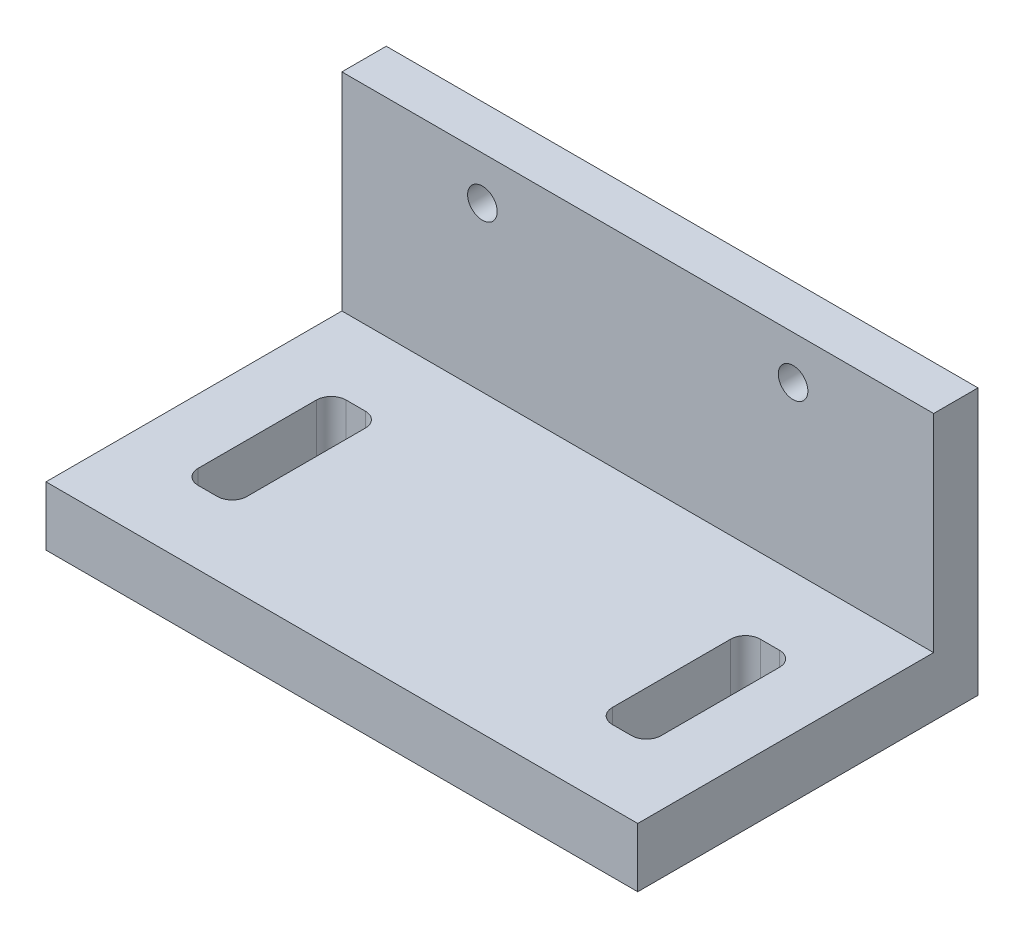
ISO-10303-21;
HEADER;
FILE_DESCRIPTION(('STEP AP214'),'2;1');
FILE_NAME('part.step','',(''),(''),'','','');
FILE_SCHEMA(('AUTOMOTIVE_DESIGN { 1 0 10303 214 1 1 1 1 }'));
ENDSEC;
DATA;
#1=APPLICATION_CONTEXT('core data for automotive mechanical design processes');
#2=APPLICATION_PROTOCOL_DEFINITION('international standard','automotive_design',2000,#1);
#3=PRODUCT_CONTEXT('',#1,'mechanical');
#4=PRODUCT('Part','Part','',(#3));
#5=PRODUCT_RELATED_PRODUCT_CATEGORY('part','',(#4));
#6=PRODUCT_DEFINITION_FORMATION('','',#4);
#7=PRODUCT_DEFINITION_CONTEXT('part definition',#1,'design');
#8=PRODUCT_DEFINITION('design','',#6,#7);
#9=PRODUCT_DEFINITION_SHAPE('','',#8);
#10=(LENGTH_UNIT() NAMED_UNIT(*) SI_UNIT(.MILLI.,.METRE.));
#11=(NAMED_UNIT(*) PLANE_ANGLE_UNIT() SI_UNIT($,.RADIAN.));
#12=(NAMED_UNIT(*) SI_UNIT($,.STERADIAN.) SOLID_ANGLE_UNIT());
#13=UNCERTAINTY_MEASURE_WITH_UNIT(LENGTH_MEASURE(1.E-05),#10,'distance_accuracy_value','');
#14=(GEOMETRIC_REPRESENTATION_CONTEXT(3) GLOBAL_UNCERTAINTY_ASSIGNED_CONTEXT((#13)) GLOBAL_UNIT_ASSIGNED_CONTEXT((#10,
#11,#12)) REPRESENTATION_CONTEXT('',''));
#15=CARTESIAN_POINT('',(0.,0.,0.));
#16=DIRECTION('',(0.,0.,1.));
#17=DIRECTION('',(1.,0.,0.));
#18=AXIS2_PLACEMENT_3D('',#15,#16,#17);
#19=CARTESIAN_POINT('',(0.,4.,0.));
#20=DIRECTION('',(0.,1.,0.));
#21=DIRECTION('',(0.,0.,1.));
#22=AXIS2_PLACEMENT_3D('',#19,#20,#21);
#23=PLANE('',#22);
#24=DIRECTION('',(0.,0.,-1.));
#25=VECTOR('',#24,1.);
#26=CARTESIAN_POINT('',(20.,4.,-10.));
#27=LINE('',#26,#25);
#28=CARTESIAN_POINT('',(20.,4.,10.));
#29=VERTEX_POINT('',#28);
#30=CARTESIAN_POINT('',(20.,4.,-10.));
#31=VERTEX_POINT('',#30);
#32=EDGE_CURVE('E331',#29,#31,#27,.T.);
#33=ORIENTED_EDGE('',*,*,#32,.T.);
#34=DIRECTION('',(-1.,0.,0.));
#35=VECTOR('',#34,1.);
#36=CARTESIAN_POINT('',(-20.,4.,-10.));
#37=LINE('',#36,#35);
#38=CARTESIAN_POINT('',(-20.,4.,-10.));
#39=VERTEX_POINT('',#38);
#40=EDGE_CURVE('E337',#31,#39,#37,.T.);
#41=ORIENTED_EDGE('',*,*,#40,.T.);
#42=DIRECTION('',(0.,0.,1.));
#43=VECTOR('',#42,1.);
#44=CARTESIAN_POINT('',(-20.,4.,-10.));
#45=LINE('',#44,#43);
#46=CARTESIAN_POINT('',(-20.,4.,10.));
#47=VERTEX_POINT('',#46);
#48=EDGE_CURVE('E211',#39,#47,#45,.T.);
#49=ORIENTED_EDGE('',*,*,#48,.T.);
#50=DIRECTION('',(1.,0.,0.));
#51=VECTOR('',#50,1.);
#52=CARTESIAN_POINT('',(-20.,4.,10.));
#53=LINE('',#52,#51);
#54=EDGE_CURVE('E338',#47,#29,#53,.T.);
#55=ORIENTED_EDGE('',*,*,#54,.T.);
#56=EDGE_LOOP('',(#33,#41,#49,#55));
#57=FACE_BOUND('',#56,.T.);
#58=DIRECTION('',(1.,0.,0.));
#59=VECTOR('',#58,1.);
#60=CARTESIAN_POINT('',(13.35,4.,5.06811078955843));
#61=LINE('',#60,#59);
#62=CARTESIAN_POINT('',(13.35,4.,5.06811078955843));
#63=VERTEX_POINT('',#62);
#64=CARTESIAN_POINT('',(14.65,4.,5.06811078955843));
#65=VERTEX_POINT('',#64);
#66=EDGE_CURVE('E277',#63,#65,#61,.T.);
#67=ORIENTED_EDGE('',*,*,#66,.F.);
#68=CARTESIAN_POINT('',(13.35,4.,4.06811078955843));
#69=DIRECTION('',(0.,1.,0.));
#70=DIRECTION('',(0.,0.,-1.));
#71=AXIS2_PLACEMENT_3D('',#68,#69,#70);
#72=CIRCLE('',#71,1.);
#73=CARTESIAN_POINT('',(12.35,4.,4.06811078955842));
#74=VERTEX_POINT('',#73);
#75=EDGE_CURVE('E274',#74,#63,#72,.T.);
#76=ORIENTED_EDGE('',*,*,#75,.F.);
#77=DIRECTION('',(0.,0.,1.));
#78=VECTOR('',#77,1.);
#79=CARTESIAN_POINT('',(12.35,4.,-3.93188921044157));
#80=LINE('',#79,#78);
#81=CARTESIAN_POINT('',(12.35,4.,-3.93188921044157));
#82=VERTEX_POINT('',#81);
#83=EDGE_CURVE('E289',#82,#74,#80,.T.);
#84=ORIENTED_EDGE('',*,*,#83,.F.);
#85=CARTESIAN_POINT('',(13.35,4.,-3.93188921044157));
#86=DIRECTION('',(0.,1.,0.));
#87=DIRECTION('',(0.,0.,-1.));
#88=AXIS2_PLACEMENT_3D('',#85,#86,#87);
#89=CIRCLE('',#88,1.);
#90=CARTESIAN_POINT('',(13.35,4.,-4.93188921044158));
#91=VERTEX_POINT('',#90);
#92=EDGE_CURVE('E290',#91,#82,#89,.T.);
#93=ORIENTED_EDGE('',*,*,#92,.F.);
#94=DIRECTION('',(-1.,0.,0.));
#95=VECTOR('',#94,1.);
#96=CARTESIAN_POINT('',(13.35,4.,-4.93188921044158));
#97=LINE('',#96,#95);
#98=CARTESIAN_POINT('',(14.65,4.,-4.93188921044157));
#99=VERTEX_POINT('',#98);
#100=EDGE_CURVE('E284',#99,#91,#97,.T.);
#101=ORIENTED_EDGE('',*,*,#100,.F.);
#102=CARTESIAN_POINT('',(14.65,4.,-3.93188921044157));
#103=DIRECTION('',(0.,1.,0.));
#104=DIRECTION('',(0.,0.,1.));
#105=AXIS2_PLACEMENT_3D('',#102,#103,#104);
#106=CIRCLE('',#105,1.);
#107=CARTESIAN_POINT('',(15.65,4.,-3.93188921044157));
#108=VERTEX_POINT('',#107);
#109=EDGE_CURVE('E282',#108,#99,#106,.T.);
#110=ORIENTED_EDGE('',*,*,#109,.F.);
#111=DIRECTION('',(0.,0.,-1.));
#112=VECTOR('',#111,1.);
#113=CARTESIAN_POINT('',(15.65,4.,-3.93188921044157));
#114=LINE('',#113,#112);
#115=CARTESIAN_POINT('',(15.65,4.,4.06811078955842));
#116=VERTEX_POINT('',#115);
#117=EDGE_CURVE('E281',#116,#108,#114,.T.);
#118=ORIENTED_EDGE('',*,*,#117,.F.);
#119=CARTESIAN_POINT('',(14.65,4.,4.06811078955843));
#120=DIRECTION('',(0.,1.,0.));
#121=DIRECTION('',(0.,0.,1.));
#122=AXIS2_PLACEMENT_3D('',#119,#120,#121);
#123=CIRCLE('',#122,1.);
#124=EDGE_CURVE('E276',#65,#116,#123,.T.);
#125=ORIENTED_EDGE('',*,*,#124,.F.);
#126=EDGE_LOOP('',(#67,#76,#84,#93,#101,#110,#118,#125));
#127=FACE_BOUND('',#126,.T.);
#128=DIRECTION('',(-1.,0.,0.));
#129=VECTOR('',#128,1.);
#130=CARTESIAN_POINT('',(-13.35,4.,-4.93188921044158));
#131=LINE('',#130,#129);
#132=CARTESIAN_POINT('',(-13.35,4.,-4.93188921044158));
#133=VERTEX_POINT('',#132);
#134=CARTESIAN_POINT('',(-14.65,4.,-4.93188921044157));
#135=VERTEX_POINT('',#134);
#136=EDGE_CURVE('E222',#133,#135,#131,.T.);
#137=ORIENTED_EDGE('',*,*,#136,.F.);
#138=CARTESIAN_POINT('',(-13.35,4.,-3.93188921044157));
#139=DIRECTION('',(0.,1.,0.));
#140=DIRECTION('',(0.,0.,1.));
#141=AXIS2_PLACEMENT_3D('',#138,#139,#140);
#142=CIRCLE('',#141,1.);
#143=CARTESIAN_POINT('',(-12.35,4.,-3.93188921044157));
#144=VERTEX_POINT('',#143);
#145=EDGE_CURVE('E225',#144,#133,#142,.T.);
#146=ORIENTED_EDGE('',*,*,#145,.F.);
#147=DIRECTION('',(0.,0.,-1.));
#148=VECTOR('',#147,1.);
#149=CARTESIAN_POINT('',(-12.35,4.,-3.93188921044157));
#150=LINE('',#149,#148);
#151=CARTESIAN_POINT('',(-12.35,4.,4.06811078955842));
#152=VERTEX_POINT('',#151);
#153=EDGE_CURVE('E240',#152,#144,#150,.T.);
#154=ORIENTED_EDGE('',*,*,#153,.F.);
#155=CARTESIAN_POINT('',(-13.35,4.,4.06811078955843));
#156=DIRECTION('',(0.,1.,0.));
#157=DIRECTION('',(0.,0.,1.));
#158=AXIS2_PLACEMENT_3D('',#155,#156,#157);
#159=CIRCLE('',#158,1.);
#160=CARTESIAN_POINT('',(-13.35,4.,5.06811078955842));
#161=VERTEX_POINT('',#160);
#162=EDGE_CURVE('E232',#161,#152,#159,.T.);
#163=ORIENTED_EDGE('',*,*,#162,.F.);
#164=DIRECTION('',(1.,0.,0.));
#165=VECTOR('',#164,1.);
#166=CARTESIAN_POINT('',(-13.35,4.,5.06811078955843));
#167=LINE('',#166,#165);
#168=CARTESIAN_POINT('',(-14.65,4.,5.06811078955843));
#169=VERTEX_POINT('',#168);
#170=EDGE_CURVE('E231',#169,#161,#167,.T.);
#171=ORIENTED_EDGE('',*,*,#170,.F.);
#172=CARTESIAN_POINT('',(-14.65,4.,4.06811078955843));
#173=DIRECTION('',(0.,1.,0.));
#174=DIRECTION('',(0.,0.,-1.));
#175=AXIS2_PLACEMENT_3D('',#172,#173,#174);
#176=CIRCLE('',#175,1.);
#177=CARTESIAN_POINT('',(-15.65,4.,4.06811078955842));
#178=VERTEX_POINT('',#177);
#179=EDGE_CURVE('E233',#178,#169,#176,.T.);
#180=ORIENTED_EDGE('',*,*,#179,.F.);
#181=DIRECTION('',(0.,0.,1.));
#182=VECTOR('',#181,1.);
#183=CARTESIAN_POINT('',(-15.65,4.,-3.93188921044157));
#184=LINE('',#183,#182);
#185=CARTESIAN_POINT('',(-15.65,4.,-3.93188921044157));
#186=VERTEX_POINT('',#185);
#187=EDGE_CURVE('E230',#186,#178,#184,.T.);
#188=ORIENTED_EDGE('',*,*,#187,.F.);
#189=CARTESIAN_POINT('',(-14.65,4.,-3.93188921044157));
#190=DIRECTION('',(0.,1.,0.));
#191=DIRECTION('',(0.,0.,-1.));
#192=AXIS2_PLACEMENT_3D('',#189,#190,#191);
#193=CIRCLE('',#192,1.);
#194=EDGE_CURVE('E227',#135,#186,#193,.T.);
#195=ORIENTED_EDGE('',*,*,#194,.F.);
#196=EDGE_LOOP('',(#137,#146,#154,#163,#171,#180,#188,#195));
#197=FACE_BOUND('',#196,.T.);
#198=ADVANCED_FACE('F39',(#57,#127,#197),#23,.T.);
#199=CARTESIAN_POINT('',(0.,0.,0.));
#200=DIRECTION('',(0.,1.,0.));
#201=DIRECTION('',(0.,0.,1.));
#202=AXIS2_PLACEMENT_3D('',#199,#200,#201);
#203=PLANE('',#202);
#204=CARTESIAN_POINT('',(13.35,0.,4.06811078955843));
#205=DIRECTION('',(0.,1.,0.));
#206=DIRECTION('',(0.,0.,-1.));
#207=AXIS2_PLACEMENT_3D('',#204,#205,#206);
#208=CIRCLE('',#207,1.);
#209=CARTESIAN_POINT('',(12.35,0.,4.06811078955842));
#210=VERTEX_POINT('',#209);
#211=CARTESIAN_POINT('',(13.35,0.,5.06811078955843));
#212=VERTEX_POINT('',#211);
#213=EDGE_CURVE('E271',#210,#212,#208,.T.);
#214=ORIENTED_EDGE('',*,*,#213,.T.);
#215=DIRECTION('',(1.,0.,0.));
#216=VECTOR('',#215,1.);
#217=CARTESIAN_POINT('',(13.35,0.,5.06811078955843));
#218=LINE('',#217,#216);
#219=CARTESIAN_POINT('',(14.65,0.,5.06811078955843));
#220=VERTEX_POINT('',#219);
#221=EDGE_CURVE('E294',#212,#220,#218,.T.);
#222=ORIENTED_EDGE('',*,*,#221,.T.);
#223=CARTESIAN_POINT('',(14.65,0.,4.06811078955843));
#224=DIRECTION('',(0.,1.,0.));
#225=DIRECTION('',(0.,0.,1.));
#226=AXIS2_PLACEMENT_3D('',#223,#224,#225);
#227=CIRCLE('',#226,1.);
#228=CARTESIAN_POINT('',(15.65,0.,4.06811078955842));
#229=VERTEX_POINT('',#228);
#230=EDGE_CURVE('E296',#220,#229,#227,.T.);
#231=ORIENTED_EDGE('',*,*,#230,.T.);
#232=DIRECTION('',(0.,0.,-1.));
#233=VECTOR('',#232,1.);
#234=CARTESIAN_POINT('',(15.65,0.,-3.93188921044157));
#235=LINE('',#234,#233);
#236=CARTESIAN_POINT('',(15.65,0.,-3.93188921044157));
#237=VERTEX_POINT('',#236);
#238=EDGE_CURVE('E301',#229,#237,#235,.T.);
#239=ORIENTED_EDGE('',*,*,#238,.T.);
#240=CARTESIAN_POINT('',(14.65,0.,-3.93188921044157));
#241=DIRECTION('',(0.,1.,0.));
#242=DIRECTION('',(0.,0.,1.));
#243=AXIS2_PLACEMENT_3D('',#240,#241,#242);
#244=CIRCLE('',#243,1.);
#245=CARTESIAN_POINT('',(14.65,0.,-4.93188921044157));
#246=VERTEX_POINT('',#245);
#247=EDGE_CURVE('E302',#237,#246,#244,.T.);
#248=ORIENTED_EDGE('',*,*,#247,.T.);
#249=DIRECTION('',(-1.,0.,0.));
#250=VECTOR('',#249,1.);
#251=CARTESIAN_POINT('',(13.35,0.,-4.93188921044158));
#252=LINE('',#251,#250);
#253=CARTESIAN_POINT('',(13.35,0.,-4.93188921044158));
#254=VERTEX_POINT('',#253);
#255=EDGE_CURVE('E310',#246,#254,#252,.T.);
#256=ORIENTED_EDGE('',*,*,#255,.T.);
#257=CARTESIAN_POINT('',(13.35,0.,-3.93188921044157));
#258=DIRECTION('',(0.,1.,0.));
#259=DIRECTION('',(0.,0.,-1.));
#260=AXIS2_PLACEMENT_3D('',#257,#258,#259);
#261=CIRCLE('',#260,1.);
#262=CARTESIAN_POINT('',(12.35,0.,-3.93188921044157));
#263=VERTEX_POINT('',#262);
#264=EDGE_CURVE('E309',#254,#263,#261,.T.);
#265=ORIENTED_EDGE('',*,*,#264,.T.);
#266=DIRECTION('',(0.,0.,1.));
#267=VECTOR('',#266,1.);
#268=CARTESIAN_POINT('',(12.35,0.,-3.93188921044157));
#269=LINE('',#268,#267);
#270=EDGE_CURVE('E280',#263,#210,#269,.T.);
#271=ORIENTED_EDGE('',*,*,#270,.T.);
#272=EDGE_LOOP('',(#214,#222,#231,#239,#248,#256,#265,#271));
#273=FACE_BOUND('',#272,.T.);
#274=DIRECTION('',(0.,0.,-1.));
#275=VECTOR('',#274,1.);
#276=CARTESIAN_POINT('',(20.,0.,-10.));
#277=LINE('',#276,#275);
#278=CARTESIAN_POINT('',(20.,0.,10.));
#279=VERTEX_POINT('',#278);
#280=CARTESIAN_POINT('',(20.,0.,-13.));
#281=VERTEX_POINT('',#280);
#282=EDGE_CURVE('E335',#279,#281,#277,.T.);
#283=ORIENTED_EDGE('',*,*,#282,.F.);
#284=DIRECTION('',(1.,0.,0.));
#285=VECTOR('',#284,1.);
#286=CARTESIAN_POINT('',(-20.,0.,10.));
#287=LINE('',#286,#285);
#288=CARTESIAN_POINT('',(-20.,0.,10.));
#289=VERTEX_POINT('',#288);
#290=EDGE_CURVE('E340',#289,#279,#287,.T.);
#291=ORIENTED_EDGE('',*,*,#290,.F.);
#292=DIRECTION('',(0.,0.,1.));
#293=VECTOR('',#292,1.);
#294=CARTESIAN_POINT('',(-20.,0.,-10.));
#295=LINE('',#294,#293);
#296=CARTESIAN_POINT('',(-20.,0.,-13.));
#297=VERTEX_POINT('',#296);
#298=EDGE_CURVE('E344',#297,#289,#295,.T.);
#299=ORIENTED_EDGE('',*,*,#298,.F.);
#300=DIRECTION('',(-1.,0.,0.));
#301=VECTOR('',#300,1.);
#302=CARTESIAN_POINT('',(-20.,0.,-13.));
#303=LINE('',#302,#301);
#304=EDGE_CURVE('E209',#281,#297,#303,.T.);
#305=ORIENTED_EDGE('',*,*,#304,.F.);
#306=EDGE_LOOP('',(#283,#291,#299,#305));
#307=FACE_BOUND('',#306,.T.);
#308=CARTESIAN_POINT('',(-13.35,0.,-3.93188921044157));
#309=DIRECTION('',(0.,1.,0.));
#310=DIRECTION('',(0.,0.,1.));
#311=AXIS2_PLACEMENT_3D('',#308,#309,#310);
#312=CIRCLE('',#311,1.);
#313=CARTESIAN_POINT('',(-12.35,0.,-3.93188921044157));
#314=VERTEX_POINT('',#313);
#315=CARTESIAN_POINT('',(-13.35,0.,-4.93188921044158));
#316=VERTEX_POINT('',#315);
#317=EDGE_CURVE('E65',#314,#316,#312,.T.);
#318=ORIENTED_EDGE('',*,*,#317,.T.);
#319=DIRECTION('',(-1.,0.,0.));
#320=VECTOR('',#319,1.);
#321=CARTESIAN_POINT('',(-13.35,0.,-4.93188921044158));
#322=LINE('',#321,#320);
#323=CARTESIAN_POINT('',(-14.65,0.,-4.93188921044157));
#324=VERTEX_POINT('',#323);
#325=EDGE_CURVE('E216',#316,#324,#322,.T.);
#326=ORIENTED_EDGE('',*,*,#325,.T.);
#327=CARTESIAN_POINT('',(-14.65,0.,-3.93188921044157));
#328=DIRECTION('',(0.,1.,0.));
#329=DIRECTION('',(0.,0.,-1.));
#330=AXIS2_PLACEMENT_3D('',#327,#328,#329);
#331=CIRCLE('',#330,1.);
#332=CARTESIAN_POINT('',(-15.65,0.,-3.93188921044157));
#333=VERTEX_POINT('',#332);
#334=EDGE_CURVE('E245',#324,#333,#331,.T.);
#335=ORIENTED_EDGE('',*,*,#334,.T.);
#336=DIRECTION('',(0.,0.,1.));
#337=VECTOR('',#336,1.);
#338=CARTESIAN_POINT('',(-15.65,0.,-3.93188921044157));
#339=LINE('',#338,#337);
#340=CARTESIAN_POINT('',(-15.65,0.,4.06811078955842));
#341=VERTEX_POINT('',#340);
#342=EDGE_CURVE('E244',#333,#341,#339,.T.);
#343=ORIENTED_EDGE('',*,*,#342,.T.);
#344=CARTESIAN_POINT('',(-14.65,0.,4.06811078955843));
#345=DIRECTION('',(0.,1.,0.));
#346=DIRECTION('',(0.,0.,-1.));
#347=AXIS2_PLACEMENT_3D('',#344,#345,#346);
#348=CIRCLE('',#347,1.);
#349=CARTESIAN_POINT('',(-14.65,0.,5.06811078955843));
#350=VERTEX_POINT('',#349);
#351=EDGE_CURVE('E247',#341,#350,#348,.T.);
#352=ORIENTED_EDGE('',*,*,#351,.T.);
#353=DIRECTION('',(1.,0.,0.));
#354=VECTOR('',#353,1.);
#355=CARTESIAN_POINT('',(-13.35,0.,5.06811078955843));
#356=LINE('',#355,#354);
#357=CARTESIAN_POINT('',(-13.35,0.,5.06811078955842));
#358=VERTEX_POINT('',#357);
#359=EDGE_CURVE('E252',#350,#358,#356,.T.);
#360=ORIENTED_EDGE('',*,*,#359,.T.);
#361=CARTESIAN_POINT('',(-13.35,0.,4.06811078955843));
#362=DIRECTION('',(0.,1.,0.));
#363=DIRECTION('',(0.,0.,1.));
#364=AXIS2_PLACEMENT_3D('',#361,#362,#363);
#365=CIRCLE('',#364,1.);
#366=CARTESIAN_POINT('',(-12.35,0.,4.06811078955842));
#367=VERTEX_POINT('',#366);
#368=EDGE_CURVE('E251',#358,#367,#365,.T.);
#369=ORIENTED_EDGE('',*,*,#368,.T.);
#370=DIRECTION('',(0.,0.,-1.));
#371=VECTOR('',#370,1.);
#372=CARTESIAN_POINT('',(-12.35,0.,-3.93188921044157));
#373=LINE('',#372,#371);
#374=EDGE_CURVE('E224',#367,#314,#373,.T.);
#375=ORIENTED_EDGE('',*,*,#374,.T.);
#376=EDGE_LOOP('',(#318,#326,#335,#343,#352,#360,#369,#375));
#377=FACE_BOUND('',#376,.T.);
#378=ADVANCED_FACE('F357',(#273,#307,#377),#203,.F.);
#379=CARTESIAN_POINT('',(20.,4.,-10.));
#380=DIRECTION('',(-1.,0.,0.));
#381=DIRECTION('',(0.,0.,1.));
#382=AXIS2_PLACEMENT_3D('',#379,#380,#381);
#383=PLANE('',#382);
#384=ORIENTED_EDGE('',*,*,#282,.T.);
#385=DIRECTION('',(0.,-1.,0.));
#386=VECTOR('',#385,1.);
#387=CARTESIAN_POINT('',(20.,18.,-13.));
#388=LINE('',#387,#386);
#389=CARTESIAN_POINT('',(20.,18.,-13.));
#390=VERTEX_POINT('',#389);
#391=EDGE_CURVE('E217',#390,#281,#388,.T.);
#392=ORIENTED_EDGE('',*,*,#391,.F.);
#393=DIRECTION('',(0.,0.,-1.));
#394=VECTOR('',#393,1.);
#395=CARTESIAN_POINT('',(20.,18.,-10.));
#396=LINE('',#395,#394);
#397=CARTESIAN_POINT('',(20.,18.,-10.));
#398=VERTEX_POINT('',#397);
#399=EDGE_CURVE('E198',#398,#390,#396,.T.);
#400=ORIENTED_EDGE('',*,*,#399,.F.);
#401=DIRECTION('',(0.,-1.,0.));
#402=VECTOR('',#401,1.);
#403=CARTESIAN_POINT('',(20.,18.,-10.));
#404=LINE('',#403,#402);
#405=EDGE_CURVE('E196',#398,#31,#404,.T.);
#406=ORIENTED_EDGE('',*,*,#405,.T.);
#407=ORIENTED_EDGE('',*,*,#32,.F.);
#408=DIRECTION('',(0.,-1.,0.));
#409=VECTOR('',#408,1.);
#410=CARTESIAN_POINT('',(20.,4.,10.));
#411=LINE('',#410,#409);
#412=EDGE_CURVE('E50',#29,#279,#411,.T.);
#413=ORIENTED_EDGE('',*,*,#412,.T.);
#414=EDGE_LOOP('',(#384,#392,#400,#406,#407,#413));
#415=FACE_BOUND('',#414,.T.);
#416=ADVANCED_FACE('F41',(#415),#383,.F.);
#417=CARTESIAN_POINT('',(-20.,4.,-10.));
#418=DIRECTION('',(1.,0.,0.));
#419=DIRECTION('',(0.,0.,-1.));
#420=AXIS2_PLACEMENT_3D('',#417,#418,#419);
#421=PLANE('',#420);
#422=ORIENTED_EDGE('',*,*,#298,.T.);
#423=DIRECTION('',(0.,-1.,0.));
#424=VECTOR('',#423,1.);
#425=CARTESIAN_POINT('',(-20.,4.,10.));
#426=LINE('',#425,#424);
#427=EDGE_CURVE('E11',#47,#289,#426,.T.);
#428=ORIENTED_EDGE('',*,*,#427,.F.);
#429=ORIENTED_EDGE('',*,*,#48,.F.);
#430=DIRECTION('',(0.,-1.,0.));
#431=VECTOR('',#430,1.);
#432=CARTESIAN_POINT('',(-20.,18.,-10.));
#433=LINE('',#432,#431);
#434=CARTESIAN_POINT('',(-20.,18.,-10.));
#435=VERTEX_POINT('',#434);
#436=EDGE_CURVE('E194',#435,#39,#433,.T.);
#437=ORIENTED_EDGE('',*,*,#436,.F.);
#438=DIRECTION('',(0.,0.,1.));
#439=VECTOR('',#438,1.);
#440=CARTESIAN_POINT('',(-20.,18.,-10.));
#441=LINE('',#440,#439);
#442=CARTESIAN_POINT('',(-20.,18.,-13.));
#443=VERTEX_POINT('',#442);
#444=EDGE_CURVE('E199',#443,#435,#441,.T.);
#445=ORIENTED_EDGE('',*,*,#444,.F.);
#446=DIRECTION('',(0.,-1.,0.));
#447=VECTOR('',#446,1.);
#448=CARTESIAN_POINT('',(-20.,18.,-13.));
#449=LINE('',#448,#447);
#450=EDGE_CURVE('E367',#443,#297,#449,.T.);
#451=ORIENTED_EDGE('',*,*,#450,.T.);
#452=EDGE_LOOP('',(#422,#428,#429,#437,#445,#451));
#453=FACE_BOUND('',#452,.T.);
#454=ADVANCED_FACE('F215',(#453),#421,.F.);
#455=CARTESIAN_POINT('',(-20.,4.,10.));
#456=DIRECTION('',(0.,0.,-1.));
#457=DIRECTION('',(-1.,0.,0.));
#458=AXIS2_PLACEMENT_3D('',#455,#456,#457);
#459=PLANE('',#458);
#460=ORIENTED_EDGE('',*,*,#290,.T.);
#461=ORIENTED_EDGE('',*,*,#412,.F.);
#462=ORIENTED_EDGE('',*,*,#54,.F.);
#463=ORIENTED_EDGE('',*,*,#427,.T.);
#464=EDGE_LOOP('',(#460,#461,#462,#463));
#465=FACE_BOUND('',#464,.T.);
#466=ADVANCED_FACE('F416',(#465),#459,.F.);
#467=CARTESIAN_POINT('',(13.35,4.,4.06811078955843));
#468=DIRECTION('',(0.,-1.,0.));
#469=DIRECTION('',(0.,0.,-1.));
#470=AXIS2_PLACEMENT_3D('',#467,#468,#469);
#471=CYLINDRICAL_SURFACE('',#470,1.);
#472=ORIENTED_EDGE('',*,*,#213,.F.);
#473=DIRECTION('',(0.,-1.,0.));
#474=VECTOR('',#473,1.);
#475=CARTESIAN_POINT('',(12.35,4.,4.06811078955842));
#476=LINE('',#475,#474);
#477=EDGE_CURVE('E292',#74,#210,#476,.T.);
#478=ORIENTED_EDGE('',*,*,#477,.F.);
#479=ORIENTED_EDGE('',*,*,#75,.T.);
#480=DIRECTION('',(0.,-1.,0.));
#481=VECTOR('',#480,1.);
#482=CARTESIAN_POINT('',(13.35,4.,5.06811078955843));
#483=LINE('',#482,#481);
#484=EDGE_CURVE('E328',#63,#212,#483,.T.);
#485=ORIENTED_EDGE('',*,*,#484,.T.);
#486=EDGE_LOOP('',(#472,#478,#479,#485));
#487=FACE_BOUND('',#486,.T.);
#488=ADVANCED_FACE('F414',(#487),#471,.F.);
#489=CARTESIAN_POINT('',(13.35,4.,5.06811078955843));
#490=DIRECTION('',(0.,0.,-1.));
#491=DIRECTION('',(-1.,0.,0.));
#492=AXIS2_PLACEMENT_3D('',#489,#490,#491);
#493=PLANE('',#492);
#494=ORIENTED_EDGE('',*,*,#221,.F.);
#495=ORIENTED_EDGE('',*,*,#484,.F.);
#496=ORIENTED_EDGE('',*,*,#66,.T.);
#497=DIRECTION('',(0.,-1.,0.));
#498=VECTOR('',#497,1.);
#499=CARTESIAN_POINT('',(14.65,4.,5.06811078955843));
#500=LINE('',#499,#498);
#501=EDGE_CURVE('E330',#65,#220,#500,.T.);
#502=ORIENTED_EDGE('',*,*,#501,.T.);
#503=EDGE_LOOP('',(#494,#495,#496,#502));
#504=FACE_BOUND('',#503,.T.);
#505=ADVANCED_FACE('F567',(#504),#493,.T.);
#506=CARTESIAN_POINT('',(14.65,4.,4.06811078955843));
#507=DIRECTION('',(0.,-1.,0.));
#508=DIRECTION('',(0.,0.,-1.));
#509=AXIS2_PLACEMENT_3D('',#506,#507,#508);
#510=CYLINDRICAL_SURFACE('',#509,1.);
#511=ORIENTED_EDGE('',*,*,#230,.F.);
#512=ORIENTED_EDGE('',*,*,#501,.F.);
#513=ORIENTED_EDGE('',*,*,#124,.T.);
#514=DIRECTION('',(0.,-1.,0.));
#515=VECTOR('',#514,1.);
#516=CARTESIAN_POINT('',(15.65,4.,4.06811078955842));
#517=LINE('',#516,#515);
#518=EDGE_CURVE('E323',#116,#229,#517,.T.);
#519=ORIENTED_EDGE('',*,*,#518,.T.);
#520=EDGE_LOOP('',(#511,#512,#513,#519));
#521=FACE_BOUND('',#520,.T.);
#522=ADVANCED_FACE('F559',(#521),#510,.F.);
#523=CARTESIAN_POINT('',(15.65,4.,-3.93188921044157));
#524=DIRECTION('',(-1.,0.,0.));
#525=DIRECTION('',(0.,0.,1.));
#526=AXIS2_PLACEMENT_3D('',#523,#524,#525);
#527=PLANE('',#526);
#528=ORIENTED_EDGE('',*,*,#238,.F.);
#529=ORIENTED_EDGE('',*,*,#518,.F.);
#530=ORIENTED_EDGE('',*,*,#117,.T.);
#531=DIRECTION('',(0.,-1.,0.));
#532=VECTOR('',#531,1.);
#533=CARTESIAN_POINT('',(15.65,4.,-3.93188921044157));
#534=LINE('',#533,#532);
#535=EDGE_CURVE('E324',#108,#237,#534,.T.);
#536=ORIENTED_EDGE('',*,*,#535,.T.);
#537=EDGE_LOOP('',(#528,#529,#530,#536));
#538=FACE_BOUND('',#537,.T.);
#539=ADVANCED_FACE('F547',(#538),#527,.T.);
#540=CARTESIAN_POINT('',(14.65,4.,-3.93188921044157));
#541=DIRECTION('',(0.,-1.,0.));
#542=DIRECTION('',(0.,0.,-1.));
#543=AXIS2_PLACEMENT_3D('',#540,#541,#542);
#544=CYLINDRICAL_SURFACE('',#543,1.);
#545=ORIENTED_EDGE('',*,*,#247,.F.);
#546=ORIENTED_EDGE('',*,*,#535,.F.);
#547=ORIENTED_EDGE('',*,*,#109,.T.);
#548=DIRECTION('',(0.,-1.,0.));
#549=VECTOR('',#548,1.);
#550=CARTESIAN_POINT('',(14.65,4.,-4.93188921044157));
#551=LINE('',#550,#549);
#552=EDGE_CURVE('E322',#99,#246,#551,.T.);
#553=ORIENTED_EDGE('',*,*,#552,.T.);
#554=EDGE_LOOP('',(#545,#546,#547,#553));
#555=FACE_BOUND('',#554,.T.);
#556=ADVANCED_FACE('F536',(#555),#544,.F.);
#557=CARTESIAN_POINT('',(13.35,4.,-4.93188921044158));
#558=DIRECTION('',(0.,0.,1.));
#559=DIRECTION('',(1.,0.,0.));
#560=AXIS2_PLACEMENT_3D('',#557,#558,#559);
#561=PLANE('',#560);
#562=ORIENTED_EDGE('',*,*,#255,.F.);
#563=ORIENTED_EDGE('',*,*,#552,.F.);
#564=ORIENTED_EDGE('',*,*,#100,.T.);
#565=DIRECTION('',(0.,-1.,0.));
#566=VECTOR('',#565,1.);
#567=CARTESIAN_POINT('',(13.35,4.,-4.93188921044158));
#568=LINE('',#567,#566);
#569=EDGE_CURVE('E316',#91,#254,#568,.T.);
#570=ORIENTED_EDGE('',*,*,#569,.T.);
#571=EDGE_LOOP('',(#562,#563,#564,#570));
#572=FACE_BOUND('',#571,.T.);
#573=ADVANCED_FACE('F527',(#572),#561,.T.);
#574=CARTESIAN_POINT('',(13.35,4.,-3.93188921044157));
#575=DIRECTION('',(0.,-1.,0.));
#576=DIRECTION('',(0.,0.,-1.));
#577=AXIS2_PLACEMENT_3D('',#574,#575,#576);
#578=CYLINDRICAL_SURFACE('',#577,1.);
#579=ORIENTED_EDGE('',*,*,#264,.F.);
#580=ORIENTED_EDGE('',*,*,#569,.F.);
#581=ORIENTED_EDGE('',*,*,#92,.T.);
#582=DIRECTION('',(0.,-1.,0.));
#583=VECTOR('',#582,1.);
#584=CARTESIAN_POINT('',(12.35,4.,-3.93188921044157));
#585=LINE('',#584,#583);
#586=EDGE_CURVE('E320',#82,#263,#585,.T.);
#587=ORIENTED_EDGE('',*,*,#586,.T.);
#588=EDGE_LOOP('',(#579,#580,#581,#587));
#589=FACE_BOUND('',#588,.T.);
#590=ADVANCED_FACE('F516',(#589),#578,.F.);
#591=CARTESIAN_POINT('',(12.35,4.,-3.93188921044157));
#592=DIRECTION('',(1.,0.,0.));
#593=DIRECTION('',(0.,0.,-1.));
#594=AXIS2_PLACEMENT_3D('',#591,#592,#593);
#595=PLANE('',#594);
#596=ORIENTED_EDGE('',*,*,#270,.F.);
#597=ORIENTED_EDGE('',*,*,#586,.F.);
#598=ORIENTED_EDGE('',*,*,#83,.T.);
#599=ORIENTED_EDGE('',*,*,#477,.T.);
#600=EDGE_LOOP('',(#596,#597,#598,#599));
#601=FACE_BOUND('',#600,.T.);
#602=ADVANCED_FACE('F509',(#601),#595,.T.);
#603=CARTESIAN_POINT('',(-13.35,4.,-3.93188921044157));
#604=DIRECTION('',(0.,-1.,0.));
#605=DIRECTION('',(0.,0.,-1.));
#606=AXIS2_PLACEMENT_3D('',#603,#604,#605);
#607=CYLINDRICAL_SURFACE('',#606,1.);
#608=ORIENTED_EDGE('',*,*,#317,.F.);
#609=DIRECTION('',(0.,-1.,0.));
#610=VECTOR('',#609,1.);
#611=CARTESIAN_POINT('',(-12.35,4.,-3.93188921044157));
#612=LINE('',#611,#610);
#613=EDGE_CURVE('E238',#144,#314,#612,.T.);
#614=ORIENTED_EDGE('',*,*,#613,.F.);
#615=ORIENTED_EDGE('',*,*,#145,.T.);
#616=DIRECTION('',(0.,-1.,0.));
#617=VECTOR('',#616,1.);
#618=CARTESIAN_POINT('',(-13.35,4.,-4.93188921044158));
#619=LINE('',#618,#617);
#620=EDGE_CURVE('E272',#133,#316,#619,.T.);
#621=ORIENTED_EDGE('',*,*,#620,.T.);
#622=EDGE_LOOP('',(#608,#614,#615,#621));
#623=FACE_BOUND('',#622,.T.);
#624=ADVANCED_FACE('F499',(#623),#607,.F.);
#625=CARTESIAN_POINT('',(-13.35,4.,-4.93188921044158));
#626=DIRECTION('',(0.,0.,1.));
#627=DIRECTION('',(1.,0.,0.));
#628=AXIS2_PLACEMENT_3D('',#625,#626,#627);
#629=PLANE('',#628);
#630=ORIENTED_EDGE('',*,*,#325,.F.);
#631=ORIENTED_EDGE('',*,*,#620,.F.);
#632=ORIENTED_EDGE('',*,*,#136,.T.);
#633=DIRECTION('',(0.,-1.,0.));
#634=VECTOR('',#633,1.);
#635=CARTESIAN_POINT('',(-14.65,4.,-4.93188921044157));
#636=LINE('',#635,#634);
#637=EDGE_CURVE('E267',#135,#324,#636,.T.);
#638=ORIENTED_EDGE('',*,*,#637,.T.);
#639=EDGE_LOOP('',(#630,#631,#632,#638));
#640=FACE_BOUND('',#639,.T.);
#641=ADVANCED_FACE('F489',(#640),#629,.T.);
#642=CARTESIAN_POINT('',(-14.65,4.,-3.93188921044157));
#643=DIRECTION('',(0.,-1.,0.));
#644=DIRECTION('',(0.,0.,-1.));
#645=AXIS2_PLACEMENT_3D('',#642,#643,#644);
#646=CYLINDRICAL_SURFACE('',#645,1.);
#647=ORIENTED_EDGE('',*,*,#334,.F.);
#648=ORIENTED_EDGE('',*,*,#637,.F.);
#649=ORIENTED_EDGE('',*,*,#194,.T.);
#650=DIRECTION('',(0.,-1.,0.));
#651=VECTOR('',#650,1.);
#652=CARTESIAN_POINT('',(-15.65,4.,-3.93188921044157));
#653=LINE('',#652,#651);
#654=EDGE_CURVE('E270',#186,#333,#653,.T.);
#655=ORIENTED_EDGE('',*,*,#654,.T.);
#656=EDGE_LOOP('',(#647,#648,#649,#655));
#657=FACE_BOUND('',#656,.T.);
#658=ADVANCED_FACE('F479',(#657),#646,.F.);
#659=CARTESIAN_POINT('',(-15.65,4.,-3.93188921044157));
#660=DIRECTION('',(1.,0.,0.));
#661=DIRECTION('',(0.,0.,-1.));
#662=AXIS2_PLACEMENT_3D('',#659,#660,#661);
#663=PLANE('',#662);
#664=ORIENTED_EDGE('',*,*,#342,.F.);
#665=ORIENTED_EDGE('',*,*,#654,.F.);
#666=ORIENTED_EDGE('',*,*,#187,.T.);
#667=DIRECTION('',(0.,-1.,0.));
#668=VECTOR('',#667,1.);
#669=CARTESIAN_POINT('',(-15.65,4.,4.06811078955842));
#670=LINE('',#669,#668);
#671=EDGE_CURVE('E264',#178,#341,#670,.T.);
#672=ORIENTED_EDGE('',*,*,#671,.T.);
#673=EDGE_LOOP('',(#664,#665,#666,#672));
#674=FACE_BOUND('',#673,.T.);
#675=ADVANCED_FACE('F468',(#674),#663,.T.);
#676=CARTESIAN_POINT('',(-14.65,4.,4.06811078955843));
#677=DIRECTION('',(0.,-1.,0.));
#678=DIRECTION('',(0.,0.,-1.));
#679=AXIS2_PLACEMENT_3D('',#676,#677,#678);
#680=CYLINDRICAL_SURFACE('',#679,1.);
#681=ORIENTED_EDGE('',*,*,#351,.F.);
#682=ORIENTED_EDGE('',*,*,#671,.F.);
#683=ORIENTED_EDGE('',*,*,#179,.T.);
#684=DIRECTION('',(0.,-1.,0.));
#685=VECTOR('',#684,1.);
#686=CARTESIAN_POINT('',(-14.65,4.,5.06811078955843));
#687=LINE('',#686,#685);
#688=EDGE_CURVE('E262',#169,#350,#687,.T.);
#689=ORIENTED_EDGE('',*,*,#688,.T.);
#690=EDGE_LOOP('',(#681,#682,#683,#689));
#691=FACE_BOUND('',#690,.T.);
#692=ADVANCED_FACE('F459',(#691),#680,.F.);
#693=CARTESIAN_POINT('',(-13.35,4.,5.06811078955843));
#694=DIRECTION('',(0.,0.,-1.));
#695=DIRECTION('',(-1.,0.,0.));
#696=AXIS2_PLACEMENT_3D('',#693,#694,#695);
#697=PLANE('',#696);
#698=ORIENTED_EDGE('',*,*,#359,.F.);
#699=ORIENTED_EDGE('',*,*,#688,.F.);
#700=ORIENTED_EDGE('',*,*,#170,.T.);
#701=DIRECTION('',(0.,-1.,0.));
#702=VECTOR('',#701,1.);
#703=CARTESIAN_POINT('',(-13.35,4.,5.06811078955842));
#704=LINE('',#703,#702);
#705=EDGE_CURVE('E261',#161,#358,#704,.T.);
#706=ORIENTED_EDGE('',*,*,#705,.T.);
#707=EDGE_LOOP('',(#698,#699,#700,#706));
#708=FACE_BOUND('',#707,.T.);
#709=ADVANCED_FACE('F448',(#708),#697,.T.);
#710=CARTESIAN_POINT('',(-13.35,4.,4.06811078955843));
#711=DIRECTION('',(0.,-1.,0.));
#712=DIRECTION('',(0.,0.,-1.));
#713=AXIS2_PLACEMENT_3D('',#710,#711,#712);
#714=CYLINDRICAL_SURFACE('',#713,1.);
#715=ORIENTED_EDGE('',*,*,#368,.F.);
#716=ORIENTED_EDGE('',*,*,#705,.F.);
#717=ORIENTED_EDGE('',*,*,#162,.T.);
#718=DIRECTION('',(0.,-1.,0.));
#719=VECTOR('',#718,1.);
#720=CARTESIAN_POINT('',(-12.35,4.,4.06811078955842));
#721=LINE('',#720,#719);
#722=EDGE_CURVE('E53',#152,#367,#721,.T.);
#723=ORIENTED_EDGE('',*,*,#722,.T.);
#724=EDGE_LOOP('',(#715,#716,#717,#723));
#725=FACE_BOUND('',#724,.T.);
#726=ADVANCED_FACE('F401',(#725),#714,.F.);
#727=CARTESIAN_POINT('',(-12.35,4.,-3.93188921044157));
#728=DIRECTION('',(-1.,0.,0.));
#729=DIRECTION('',(0.,0.,1.));
#730=AXIS2_PLACEMENT_3D('',#727,#728,#729);
#731=PLANE('',#730);
#732=ORIENTED_EDGE('',*,*,#374,.F.);
#733=ORIENTED_EDGE('',*,*,#722,.F.);
#734=ORIENTED_EDGE('',*,*,#153,.T.);
#735=ORIENTED_EDGE('',*,*,#613,.T.);
#736=EDGE_LOOP('',(#732,#733,#734,#735));
#737=FACE_BOUND('',#736,.T.);
#738=ADVANCED_FACE('F398',(#737),#731,.T.);
#739=CARTESIAN_POINT('',(-20.,18.,-10.));
#740=DIRECTION('',(0.,0.,-1.));
#741=DIRECTION('',(-1.,0.,0.));
#742=AXIS2_PLACEMENT_3D('',#739,#740,#741);
#743=PLANE('',#742);
#744=CARTESIAN_POINT('',(-10.5,15.0632300434445,-10.));
#745=DIRECTION('',(0.,0.,-1.));
#746=DIRECTION('',(-1.,0.,0.));
#747=AXIS2_PLACEMENT_3D('',#744,#745,#746);
#748=CIRCLE('',#747,1.);
#749=CARTESIAN_POINT('',(-11.5,15.0632300434445,-10.));
#750=VERTEX_POINT('',#749);
#751=EDGE_CURVE('E363',#750,#750,#748,.T.);
#752=ORIENTED_EDGE('',*,*,#751,.T.);
#753=EDGE_LOOP('',(#752));
#754=FACE_BOUND('',#753,.T.);
#755=CARTESIAN_POINT('',(10.5,15.0632300434445,-10.));
#756=DIRECTION('',(0.,0.,-1.));
#757=DIRECTION('',(-1.,0.,0.));
#758=AXIS2_PLACEMENT_3D('',#755,#756,#757);
#759=CIRCLE('',#758,1.);
#760=CARTESIAN_POINT('',(9.5,15.0632300434445,-10.));
#761=VERTEX_POINT('',#760);
#762=EDGE_CURVE('E364',#761,#761,#759,.T.);
#763=ORIENTED_EDGE('',*,*,#762,.T.);
#764=EDGE_LOOP('',(#763));
#765=FACE_BOUND('',#764,.T.);
#766=ORIENTED_EDGE('',*,*,#40,.F.);
#767=ORIENTED_EDGE('',*,*,#405,.F.);
#768=DIRECTION('',(1.,0.,0.));
#769=VECTOR('',#768,1.);
#770=CARTESIAN_POINT('',(-20.,18.,-10.));
#771=LINE('',#770,#769);
#772=EDGE_CURVE('E186',#435,#398,#771,.T.);
#773=ORIENTED_EDGE('',*,*,#772,.F.);
#774=ORIENTED_EDGE('',*,*,#436,.T.);
#775=EDGE_LOOP('',(#766,#767,#773,#774));
#776=FACE_BOUND('',#775,.T.);
#777=ADVANCED_FACE('F192',(#754,#765,#776),#743,.F.);
#778=CARTESIAN_POINT('',(-20.,18.,-13.));
#779=DIRECTION('',(0.,0.,1.));
#780=DIRECTION('',(1.,0.,0.));
#781=AXIS2_PLACEMENT_3D('',#778,#779,#780);
#782=PLANE('',#781);
#783=CARTESIAN_POINT('',(-10.5,15.0632300434445,-13.));
#784=DIRECTION('',(0.,0.,-1.));
#785=DIRECTION('',(-1.,0.,0.));
#786=AXIS2_PLACEMENT_3D('',#783,#784,#785);
#787=CIRCLE('',#786,1.);
#788=CARTESIAN_POINT('',(-11.5,15.0632300434445,-13.));
#789=VERTEX_POINT('',#788);
#790=EDGE_CURVE('E372',#789,#789,#787,.T.);
#791=ORIENTED_EDGE('',*,*,#790,.F.);
#792=EDGE_LOOP('',(#791));
#793=FACE_BOUND('',#792,.T.);
#794=CARTESIAN_POINT('',(10.5,15.0632300434445,-13.));
#795=DIRECTION('',(0.,0.,-1.));
#796=DIRECTION('',(1.,0.,0.));
#797=AXIS2_PLACEMENT_3D('',#794,#795,#796);
#798=CIRCLE('',#797,1.);
#799=CARTESIAN_POINT('',(11.5,15.0632300434445,-13.));
#800=VERTEX_POINT('',#799);
#801=EDGE_CURVE('E374',#800,#800,#798,.T.);
#802=ORIENTED_EDGE('',*,*,#801,.F.);
#803=EDGE_LOOP('',(#802));
#804=FACE_BOUND('',#803,.T.);
#805=ORIENTED_EDGE('',*,*,#304,.T.);
#806=ORIENTED_EDGE('',*,*,#450,.F.);
#807=DIRECTION('',(-1.,0.,0.));
#808=VECTOR('',#807,1.);
#809=CARTESIAN_POINT('',(-20.,18.,-13.));
#810=LINE('',#809,#808);
#811=EDGE_CURVE('E204',#390,#443,#810,.T.);
#812=ORIENTED_EDGE('',*,*,#811,.F.);
#813=ORIENTED_EDGE('',*,*,#391,.T.);
#814=EDGE_LOOP('',(#805,#806,#812,#813));
#815=FACE_BOUND('',#814,.T.);
#816=ADVANCED_FACE('F369',(#793,#804,#815),#782,.F.);
#817=CARTESIAN_POINT('',(0.,18.,0.));
#818=DIRECTION('',(0.,-1.,0.));
#819=DIRECTION('',(0.,0.,-1.));
#820=AXIS2_PLACEMENT_3D('',#817,#818,#819);
#821=PLANE('',#820);
#822=ORIENTED_EDGE('',*,*,#444,.T.);
#823=ORIENTED_EDGE('',*,*,#772,.T.);
#824=ORIENTED_EDGE('',*,*,#399,.T.);
#825=ORIENTED_EDGE('',*,*,#811,.T.);
#826=EDGE_LOOP('',(#822,#823,#824,#825));
#827=FACE_BOUND('',#826,.T.);
#828=ADVANCED_FACE('F201',(#827),#821,.F.);
#829=CARTESIAN_POINT('',(10.5,15.0632300434445,10.));
#830=DIRECTION('',(0.,0.,-1.));
#831=DIRECTION('',(-1.,0.,0.));
#832=AXIS2_PLACEMENT_3D('',#829,#830,#831);
#833=CYLINDRICAL_SURFACE('',#832,1.);
#834=ORIENTED_EDGE('',*,*,#801,.T.);
#835=EDGE_LOOP('',(#834));
#836=FACE_BOUND('',#835,.T.);
#837=ORIENTED_EDGE('',*,*,#762,.F.);
#838=EDGE_LOOP('',(#837));
#839=FACE_BOUND('',#838,.T.);
#840=ADVANCED_FACE('F386',(#836,#839),#833,.F.);
#841=CARTESIAN_POINT('',(-10.5,15.0632300434445,10.));
#842=DIRECTION('',(0.,0.,-1.));
#843=DIRECTION('',(-1.,0.,0.));
#844=AXIS2_PLACEMENT_3D('',#841,#842,#843);
#845=CYLINDRICAL_SURFACE('',#844,1.);
#846=ORIENTED_EDGE('',*,*,#790,.T.);
#847=EDGE_LOOP('',(#846));
#848=FACE_BOUND('',#847,.T.);
#849=ORIENTED_EDGE('',*,*,#751,.F.);
#850=EDGE_LOOP('',(#849));
#851=FACE_BOUND('',#850,.T.);
#852=ADVANCED_FACE('F382',(#848,#851),#845,.F.);
#853=CLOSED_SHELL('',(#198,#378,#416,#454,#466,#488,#505,#522,#539,#556,#573,#590,#602,#624,
#641,#658,#675,#692,#709,#726,#738,#777,#816,#828,#840,#852));
#854=MANIFOLD_SOLID_BREP('B2',#853);
#855=ADVANCED_BREP_SHAPE_REPRESENTATION('',(#18,#854),#14);
#856=SHAPE_DEFINITION_REPRESENTATION(#9,#855);
ENDSEC;
END-ISO-10303-21;
